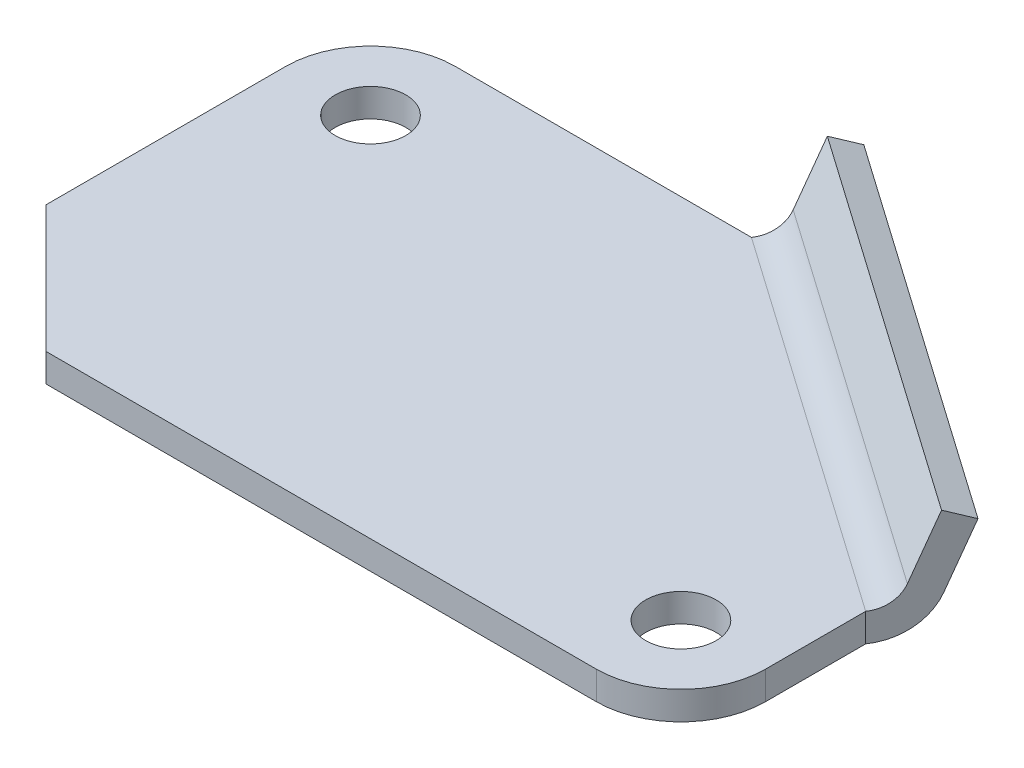
ISO-10303-21;
HEADER;
FILE_DESCRIPTION(('STEP AP214'),'2;1');
FILE_NAME('part.step','',(''),(''),'','','');
FILE_SCHEMA(('AUTOMOTIVE_DESIGN { 1 0 10303 214 1 1 1 1 }'));
ENDSEC;
DATA;
#1=APPLICATION_CONTEXT('core data for automotive mechanical design processes');
#2=APPLICATION_PROTOCOL_DEFINITION('international standard','automotive_design',2000,#1);
#3=PRODUCT_CONTEXT('',#1,'mechanical');
#4=PRODUCT('Part','Part','',(#3));
#5=PRODUCT_RELATED_PRODUCT_CATEGORY('part','',(#4));
#6=PRODUCT_DEFINITION_FORMATION('','',#4);
#7=PRODUCT_DEFINITION_CONTEXT('part definition',#1,'design');
#8=PRODUCT_DEFINITION('design','',#6,#7);
#9=PRODUCT_DEFINITION_SHAPE('','',#8);
#10=(LENGTH_UNIT() NAMED_UNIT(*) SI_UNIT(.MILLI.,.METRE.));
#11=(NAMED_UNIT(*) PLANE_ANGLE_UNIT() SI_UNIT($,.RADIAN.));
#12=(NAMED_UNIT(*) SI_UNIT($,.STERADIAN.) SOLID_ANGLE_UNIT());
#13=UNCERTAINTY_MEASURE_WITH_UNIT(LENGTH_MEASURE(1.E-05),#10,'distance_accuracy_value','');
#14=(GEOMETRIC_REPRESENTATION_CONTEXT(3) GLOBAL_UNCERTAINTY_ASSIGNED_CONTEXT((#13)) GLOBAL_UNIT_ASSIGNED_CONTEXT((#10,
#11,#12)) REPRESENTATION_CONTEXT('',''));
#15=CARTESIAN_POINT('',(0.,0.,0.));
#16=DIRECTION('',(0.,0.,1.));
#17=DIRECTION('',(1.,0.,0.));
#18=AXIS2_PLACEMENT_3D('',#15,#16,#17);
#19=CARTESIAN_POINT('',(96.,4.,-12.));
#20=DIRECTION('',(0.,1.,0.));
#21=DIRECTION('',(0.,0.,1.));
#22=AXIS2_PLACEMENT_3D('',#19,#20,#21);
#23=PLANE('',#22);
#24=CARTESIAN_POINT('',(12.,4.,-52.));
#25=DIRECTION('',(0.,1.,0.));
#26=DIRECTION('',(0.,0.,1.));
#27=AXIS2_PLACEMENT_3D('',#24,#25,#26);
#28=CIRCLE('',#27,5.);
#29=CARTESIAN_POINT('',(12.,4.,-47.));
#30=VERTEX_POINT('',#29);
#31=EDGE_CURVE('E143',#30,#30,#28,.T.);
#32=ORIENTED_EDGE('',*,*,#31,.F.);
#33=EDGE_LOOP('',(#32));
#34=FACE_BOUND('',#33,.T.);
#35=DIRECTION('',(1.,0.,0.));
#36=VECTOR('',#35,1.);
#37=CARTESIAN_POINT('',(18.,4.,0.));
#38=LINE('',#37,#36);
#39=CARTESIAN_POINT('',(18.,4.,0.));
#40=VERTEX_POINT('',#39);
#41=CARTESIAN_POINT('',(96.,4.,0.));
#42=VERTEX_POINT('',#41);
#43=EDGE_CURVE('E152',#40,#42,#38,.T.);
#44=ORIENTED_EDGE('',*,*,#43,.T.);
#45=CARTESIAN_POINT('',(96.,4.,-12.));
#46=DIRECTION('',(0.,1.,0.));
#47=DIRECTION('',(0.,0.,1.));
#48=AXIS2_PLACEMENT_3D('',#45,#46,#47);
#49=CIRCLE('',#48,12.);
#50=CARTESIAN_POINT('',(108.,4.,-12.));
#51=VERTEX_POINT('',#50);
#52=EDGE_CURVE('E100',#42,#51,#49,.T.);
#53=ORIENTED_EDGE('',*,*,#52,.T.);
#54=DIRECTION('',(0.,0.,-1.));
#55=VECTOR('',#54,1.);
#56=CARTESIAN_POINT('',(108.,4.,-12.));
#57=LINE('',#56,#55);
#58=CARTESIAN_POINT('',(108.,4.,-26.1887929366757));
#59=VERTEX_POINT('',#58);
#60=EDGE_CURVE('E169',#51,#59,#57,.T.);
#61=ORIENTED_EDGE('',*,*,#60,.T.);
#62=DIRECTION('',(-0.819152044288992,0.,-0.573576436351045));
#63=VECTOR('',#62,1.);
#64=CARTESIAN_POINT('',(54.,4.,-64.));
#65=LINE('',#64,#63);
#66=CARTESIAN_POINT('',(54.,4.,-64.));
#67=VERTEX_POINT('',#66);
#68=EDGE_CURVE('E237',#59,#67,#65,.T.);
#69=ORIENTED_EDGE('',*,*,#68,.T.);
#70=DIRECTION('',(-1.,0.,0.));
#71=VECTOR('',#70,1.);
#72=CARTESIAN_POINT('',(12.,4.,-64.));
#73=LINE('',#72,#71);
#74=CARTESIAN_POINT('',(12.,4.,-64.));
#75=VERTEX_POINT('',#74);
#76=EDGE_CURVE('E116',#67,#75,#73,.T.);
#77=ORIENTED_EDGE('',*,*,#76,.T.);
#78=CARTESIAN_POINT('',(12.,4.,-52.));
#79=DIRECTION('',(0.,1.,0.));
#80=DIRECTION('',(0.,0.,1.));
#81=AXIS2_PLACEMENT_3D('',#78,#79,#80);
#82=CIRCLE('',#81,12.);
#83=CARTESIAN_POINT('',(0.,4.,-52.));
#84=VERTEX_POINT('',#83);
#85=EDGE_CURVE('E114',#75,#84,#82,.T.);
#86=ORIENTED_EDGE('',*,*,#85,.T.);
#87=DIRECTION('',(0.,0.,1.));
#88=VECTOR('',#87,1.);
#89=CARTESIAN_POINT('',(0.,4.,-18.));
#90=LINE('',#89,#88);
#91=CARTESIAN_POINT('',(0.,4.,-18.));
#92=VERTEX_POINT('',#91);
#93=EDGE_CURVE('E120',#84,#92,#90,.T.);
#94=ORIENTED_EDGE('',*,*,#93,.T.);
#95=DIRECTION('',(0.707106781186547,0.,0.707106781186547));
#96=VECTOR('',#95,1.);
#97=CARTESIAN_POINT('',(0.,4.,-18.));
#98=LINE('',#97,#96);
#99=EDGE_CURVE('E57',#92,#40,#98,.T.);
#100=ORIENTED_EDGE('',*,*,#99,.T.);
#101=EDGE_LOOP('',(#44,#53,#61,#69,#77,#86,#94,#100));
#102=FACE_BOUND('',#101,.T.);
#103=CARTESIAN_POINT('',(96.,4.,-12.));
#104=DIRECTION('',(0.,1.,0.));
#105=DIRECTION('',(0.,0.,1.));
#106=AXIS2_PLACEMENT_3D('',#103,#104,#105);
#107=CIRCLE('',#106,5.);
#108=CARTESIAN_POINT('',(96.,4.,-7.));
#109=VERTEX_POINT('',#108);
#110=EDGE_CURVE('E224',#109,#109,#107,.T.);
#111=ORIENTED_EDGE('',*,*,#110,.F.);
#112=EDGE_LOOP('',(#111));
#113=FACE_BOUND('',#112,.T.);
#114=ADVANCED_FACE('F39',(#34,#102,#113),#23,.T.);
#115=CARTESIAN_POINT('',(96.,0.,-12.));
#116=DIRECTION('',(0.,1.,0.));
#117=DIRECTION('',(0.,0.,1.));
#118=AXIS2_PLACEMENT_3D('',#115,#116,#117);
#119=PLANE('',#118);
#120=DIRECTION('',(1.,0.,0.));
#121=VECTOR('',#120,1.);
#122=CARTESIAN_POINT('',(18.,0.,0.));
#123=LINE('',#122,#121);
#124=CARTESIAN_POINT('',(18.,0.,0.));
#125=VERTEX_POINT('',#124);
#126=CARTESIAN_POINT('',(96.,0.,0.));
#127=VERTEX_POINT('',#126);
#128=EDGE_CURVE('E136',#125,#127,#123,.T.);
#129=ORIENTED_EDGE('',*,*,#128,.F.);
#130=DIRECTION('',(0.707106781186547,0.,0.707106781186547));
#131=VECTOR('',#130,1.);
#132=CARTESIAN_POINT('',(0.,0.,-18.));
#133=LINE('',#132,#131);
#134=CARTESIAN_POINT('',(0.,0.,-18.));
#135=VERTEX_POINT('',#134);
#136=EDGE_CURVE('E90',#135,#125,#133,.T.);
#137=ORIENTED_EDGE('',*,*,#136,.F.);
#138=DIRECTION('',(0.,0.,1.));
#139=VECTOR('',#138,1.);
#140=CARTESIAN_POINT('',(0.,0.,-18.));
#141=LINE('',#140,#139);
#142=CARTESIAN_POINT('',(0.,0.,-52.));
#143=VERTEX_POINT('',#142);
#144=EDGE_CURVE('E85',#143,#135,#141,.T.);
#145=ORIENTED_EDGE('',*,*,#144,.F.);
#146=CARTESIAN_POINT('',(12.,0.,-52.));
#147=DIRECTION('',(0.,1.,0.));
#148=DIRECTION('',(0.,0.,1.));
#149=AXIS2_PLACEMENT_3D('',#146,#147,#148);
#150=CIRCLE('',#149,12.);
#151=CARTESIAN_POINT('',(12.,0.,-64.));
#152=VERTEX_POINT('',#151);
#153=EDGE_CURVE('E130',#152,#143,#150,.T.);
#154=ORIENTED_EDGE('',*,*,#153,.F.);
#155=DIRECTION('',(-1.,0.,0.));
#156=VECTOR('',#155,1.);
#157=CARTESIAN_POINT('',(12.,0.,-64.));
#158=LINE('',#157,#156);
#159=CARTESIAN_POINT('',(54.,0.,-64.));
#160=VERTEX_POINT('',#159);
#161=EDGE_CURVE('E149',#160,#152,#158,.T.);
#162=ORIENTED_EDGE('',*,*,#161,.F.);
#163=DIRECTION('',(-0.819152044288992,0.,-0.573576436351045));
#164=VECTOR('',#163,1.);
#165=CARTESIAN_POINT('',(54.,0.,-64.));
#166=LINE('',#165,#164);
#167=CARTESIAN_POINT('',(108.,0.,-26.1887929366758));
#168=VERTEX_POINT('',#167);
#169=EDGE_CURVE('E148',#168,#160,#166,.T.);
#170=ORIENTED_EDGE('',*,*,#169,.F.);
#171=DIRECTION('',(0.,0.,-1.));
#172=VECTOR('',#171,1.);
#173=CARTESIAN_POINT('',(108.,0.,-12.));
#174=LINE('',#173,#172);
#175=CARTESIAN_POINT('',(108.,0.,-12.));
#176=VERTEX_POINT('',#175);
#177=EDGE_CURVE('E141',#176,#168,#174,.T.);
#178=ORIENTED_EDGE('',*,*,#177,.F.);
#179=CARTESIAN_POINT('',(96.,0.,-12.));
#180=DIRECTION('',(0.,1.,0.));
#181=DIRECTION('',(0.,0.,1.));
#182=AXIS2_PLACEMENT_3D('',#179,#180,#181);
#183=CIRCLE('',#182,12.);
#184=EDGE_CURVE('E137',#127,#176,#183,.T.);
#185=ORIENTED_EDGE('',*,*,#184,.F.);
#186=EDGE_LOOP('',(#129,#137,#145,#154,#162,#170,#178,#185));
#187=FACE_BOUND('',#186,.T.);
#188=CARTESIAN_POINT('',(12.,0.,-52.));
#189=DIRECTION('',(0.,1.,0.));
#190=DIRECTION('',(0.,0.,1.));
#191=AXIS2_PLACEMENT_3D('',#188,#189,#190);
#192=CIRCLE('',#191,5.);
#193=CARTESIAN_POINT('',(12.,0.,-47.));
#194=VERTEX_POINT('',#193);
#195=EDGE_CURVE('E227',#194,#194,#192,.T.);
#196=ORIENTED_EDGE('',*,*,#195,.T.);
#197=EDGE_LOOP('',(#196));
#198=FACE_BOUND('',#197,.T.);
#199=CARTESIAN_POINT('',(96.,0.,-12.));
#200=DIRECTION('',(0.,1.,0.));
#201=DIRECTION('',(0.,0.,1.));
#202=AXIS2_PLACEMENT_3D('',#199,#200,#201);
#203=CIRCLE('',#202,5.);
#204=CARTESIAN_POINT('',(96.,0.,-7.));
#205=VERTEX_POINT('',#204);
#206=EDGE_CURVE('E225',#205,#205,#203,.T.);
#207=ORIENTED_EDGE('',*,*,#206,.T.);
#208=EDGE_LOOP('',(#207));
#209=FACE_BOUND('',#208,.T.);
#210=ADVANCED_FACE('F175',(#187,#198,#209),#119,.F.);
#211=CARTESIAN_POINT('',(18.,4.,0.));
#212=DIRECTION('',(0.,0.,-1.));
#213=DIRECTION('',(-1.,0.,0.));
#214=AXIS2_PLACEMENT_3D('',#211,#212,#213);
#215=PLANE('',#214);
#216=ORIENTED_EDGE('',*,*,#128,.T.);
#217=DIRECTION('',(0.,-1.,0.));
#218=VECTOR('',#217,1.);
#219=CARTESIAN_POINT('',(96.,4.,0.));
#220=LINE('',#219,#218);
#221=EDGE_CURVE('E11',#42,#127,#220,.T.);
#222=ORIENTED_EDGE('',*,*,#221,.F.);
#223=ORIENTED_EDGE('',*,*,#43,.F.);
#224=DIRECTION('',(0.,-1.,0.));
#225=VECTOR('',#224,1.);
#226=CARTESIAN_POINT('',(18.,4.,0.));
#227=LINE('',#226,#225);
#228=EDGE_CURVE('E134',#40,#125,#227,.T.);
#229=ORIENTED_EDGE('',*,*,#228,.T.);
#230=EDGE_LOOP('',(#216,#222,#223,#229));
#231=FACE_BOUND('',#230,.T.);
#232=ADVANCED_FACE('F41',(#231),#215,.F.);
#233=CARTESIAN_POINT('',(96.,4.,-12.));
#234=DIRECTION('',(0.,-1.,0.));
#235=DIRECTION('',(0.,0.,-1.));
#236=AXIS2_PLACEMENT_3D('',#233,#234,#235);
#237=CYLINDRICAL_SURFACE('',#236,12.);
#238=ORIENTED_EDGE('',*,*,#184,.T.);
#239=DIRECTION('',(0.,-1.,0.));
#240=VECTOR('',#239,1.);
#241=CARTESIAN_POINT('',(108.,4.,-12.));
#242=LINE('',#241,#240);
#243=EDGE_CURVE('E48',#51,#176,#242,.T.);
#244=ORIENTED_EDGE('',*,*,#243,.F.);
#245=ORIENTED_EDGE('',*,*,#52,.F.);
#246=ORIENTED_EDGE('',*,*,#221,.T.);
#247=EDGE_LOOP('',(#238,#244,#245,#246));
#248=FACE_BOUND('',#247,.T.);
#249=ADVANCED_FACE('F309',(#248),#237,.T.);
#250=CARTESIAN_POINT('',(108.,4.,-12.));
#251=DIRECTION('',(-1.,0.,0.));
#252=DIRECTION('',(0.,0.,1.));
#253=AXIS2_PLACEMENT_3D('',#250,#251,#252);
#254=PLANE('',#253);
#255=ORIENTED_EDGE('',*,*,#177,.T.);
#256=DIRECTION('',(0.,-1.,0.));
#257=VECTOR('',#256,1.);
#258=CARTESIAN_POINT('',(108.,4.,-26.1887929366757));
#259=LINE('',#258,#257);
#260=EDGE_CURVE('E159',#59,#168,#259,.T.);
#261=ORIENTED_EDGE('',*,*,#260,.F.);
#262=ORIENTED_EDGE('',*,*,#60,.F.);
#263=ORIENTED_EDGE('',*,*,#243,.T.);
#264=EDGE_LOOP('',(#255,#261,#262,#263));
#265=FACE_BOUND('',#264,.T.);
#266=ADVANCED_FACE('F167',(#265),#254,.F.);
#267=CARTESIAN_POINT('',(12.,4.,-64.));
#268=DIRECTION('',(0.,0.,1.));
#269=DIRECTION('',(1.,0.,0.));
#270=AXIS2_PLACEMENT_3D('',#267,#268,#269);
#271=PLANE('',#270);
#272=ORIENTED_EDGE('',*,*,#161,.T.);
#273=DIRECTION('',(0.,-1.,0.));
#274=VECTOR('',#273,1.);
#275=CARTESIAN_POINT('',(12.,4.,-64.));
#276=LINE('',#275,#274);
#277=EDGE_CURVE('E126',#75,#152,#276,.T.);
#278=ORIENTED_EDGE('',*,*,#277,.F.);
#279=ORIENTED_EDGE('',*,*,#76,.F.);
#280=DIRECTION('',(0.,-1.,0.));
#281=VECTOR('',#280,1.);
#282=CARTESIAN_POINT('',(54.,4.,-64.));
#283=LINE('',#282,#281);
#284=EDGE_CURVE('E158',#67,#160,#283,.T.);
#285=ORIENTED_EDGE('',*,*,#284,.T.);
#286=EDGE_LOOP('',(#272,#278,#279,#285));
#287=FACE_BOUND('',#286,.T.);
#288=ADVANCED_FACE('F242',(#287),#271,.F.);
#289=CARTESIAN_POINT('',(12.,4.,-52.));
#290=DIRECTION('',(0.,-1.,0.));
#291=DIRECTION('',(0.,0.,-1.));
#292=AXIS2_PLACEMENT_3D('',#289,#290,#291);
#293=CYLINDRICAL_SURFACE('',#292,12.);
#294=ORIENTED_EDGE('',*,*,#153,.T.);
#295=DIRECTION('',(0.,-1.,0.));
#296=VECTOR('',#295,1.);
#297=CARTESIAN_POINT('',(0.,4.,-52.));
#298=LINE('',#297,#296);
#299=EDGE_CURVE('E123',#84,#143,#298,.T.);
#300=ORIENTED_EDGE('',*,*,#299,.F.);
#301=ORIENTED_EDGE('',*,*,#85,.F.);
#302=ORIENTED_EDGE('',*,*,#277,.T.);
#303=EDGE_LOOP('',(#294,#300,#301,#302));
#304=FACE_BOUND('',#303,.T.);
#305=ADVANCED_FACE('F122',(#304),#293,.T.);
#306=CARTESIAN_POINT('',(0.,4.,-18.));
#307=DIRECTION('',(1.,0.,0.));
#308=DIRECTION('',(0.,0.,-1.));
#309=AXIS2_PLACEMENT_3D('',#306,#307,#308);
#310=PLANE('',#309);
#311=ORIENTED_EDGE('',*,*,#144,.T.);
#312=DIRECTION('',(0.,-1.,0.));
#313=VECTOR('',#312,1.);
#314=CARTESIAN_POINT('',(0.,4.,-18.));
#315=LINE('',#314,#313);
#316=EDGE_CURVE('E129',#92,#135,#315,.T.);
#317=ORIENTED_EDGE('',*,*,#316,.F.);
#318=ORIENTED_EDGE('',*,*,#93,.F.);
#319=ORIENTED_EDGE('',*,*,#299,.T.);
#320=EDGE_LOOP('',(#311,#317,#318,#319));
#321=FACE_BOUND('',#320,.T.);
#322=ADVANCED_FACE('F132',(#321),#310,.F.);
#323=CARTESIAN_POINT('',(0.,4.,-18.));
#324=DIRECTION('',(0.707106781186547,0.,-0.707106781186547));
#325=DIRECTION('',(-0.707106781186548,0.,-0.707106781186548));
#326=AXIS2_PLACEMENT_3D('',#323,#324,#325);
#327=PLANE('',#326);
#328=ORIENTED_EDGE('',*,*,#136,.T.);
#329=ORIENTED_EDGE('',*,*,#228,.F.);
#330=ORIENTED_EDGE('',*,*,#99,.F.);
#331=ORIENTED_EDGE('',*,*,#316,.T.);
#332=EDGE_LOOP('',(#328,#329,#330,#331));
#333=FACE_BOUND('',#332,.T.);
#334=ADVANCED_FACE('F298',(#333),#327,.F.);
#335=CARTESIAN_POINT('',(12.,4.,-52.));
#336=DIRECTION('',(0.,-1.,0.));
#337=DIRECTION('',(0.,0.,-1.));
#338=AXIS2_PLACEMENT_3D('',#335,#336,#337);
#339=CYLINDRICAL_SURFACE('',#338,5.);
#340=ORIENTED_EDGE('',*,*,#31,.T.);
#341=EDGE_LOOP('',(#340));
#342=FACE_BOUND('',#341,.T.);
#343=ORIENTED_EDGE('',*,*,#195,.F.);
#344=EDGE_LOOP('',(#343));
#345=FACE_BOUND('',#344,.T.);
#346=ADVANCED_FACE('F300',(#342,#345),#339,.F.);
#347=CARTESIAN_POINT('',(96.,4.,-12.));
#348=DIRECTION('',(0.,-1.,0.));
#349=DIRECTION('',(0.,0.,-1.));
#350=AXIS2_PLACEMENT_3D('',#347,#348,#349);
#351=CYLINDRICAL_SURFACE('',#350,5.);
#352=ORIENTED_EDGE('',*,*,#110,.T.);
#353=EDGE_LOOP('',(#352));
#354=FACE_BOUND('',#353,.T.);
#355=ORIENTED_EDGE('',*,*,#206,.F.);
#356=EDGE_LOOP('',(#355));
#357=FACE_BOUND('',#356,.T.);
#358=ADVANCED_FACE('F369',(#354,#357),#351,.F.);
#359=CARTESIAN_POINT('',(108.,8.5825091964613,-26.1887929366758));
#360=DIRECTION('',(-0.819152044288992,0.,-0.573576436351045));
#361=DIRECTION('',(-0.573576436351045,0.,0.819152044288992));
#362=AXIS2_PLACEMENT_3D('',#359,#360,#361);
#363=CYLINDRICAL_SURFACE('',#362,8.5825091964613);
#364=CARTESIAN_POINT('',(54.,8.5825091964613,-64.));
#365=DIRECTION('',(0.819152044288992,0.,0.573576436351045));
#366=DIRECTION('',(0.573576436351045,0.,-0.819152044288992));
#367=AXIS2_PLACEMENT_3D('',#364,#365,#366);
#368=CIRCLE('',#367,8.5825091964613);
#369=CARTESIAN_POINT('',(58.5642711774265,5.36744466341422,-70.5184547842721));
#370=VERTEX_POINT('',#369);
#371=EDGE_CURVE('E184',#160,#370,#368,.T.);
#372=ORIENTED_EDGE('',*,*,#371,.T.);
#373=DIRECTION('',(-0.819152044288992,0.,-0.573576436351045));
#374=VECTOR('',#373,1.);
#375=CARTESIAN_POINT('',(112.564271177426,5.36744466341422,-32.7072477209479));
#376=LINE('',#375,#374);
#377=CARTESIAN_POINT('',(112.564271177426,5.36744466341422,-32.7072477209479));
#378=VERTEX_POINT('',#377);
#379=EDGE_CURVE('E219',#378,#370,#376,.T.);
#380=ORIENTED_EDGE('',*,*,#379,.F.);
#381=CARTESIAN_POINT('',(108.,8.5825091964613,-26.1887929366758));
#382=DIRECTION('',(0.819152044288992,0.,0.573576436351045));
#383=DIRECTION('',(0.573576436351045,0.,-0.819152044288992));
#384=AXIS2_PLACEMENT_3D('',#381,#382,#383);
#385=CIRCLE('',#384,8.5825091964613);
#386=EDGE_CURVE('E187',#168,#378,#385,.T.);
#387=ORIENTED_EDGE('',*,*,#386,.F.);
#388=ORIENTED_EDGE('',*,*,#169,.T.);
#389=EDGE_LOOP('',(#372,#380,#387,#388));
#390=FACE_BOUND('',#389,.T.);
#391=ADVANCED_FACE('F182',(#390),#363,.T.);
#392=CARTESIAN_POINT('',(112.564271177426,5.36744466341422,-32.7072477209479));
#393=DIRECTION('',(-0.531810811144645,0.374606593415909,0.759504549900132));
#394=DIRECTION('',(0.819152044288992,0.,0.573576436351045));
#395=AXIS2_PLACEMENT_3D('',#392,#393,#394);
#396=PLANE('',#395);
#397=DIRECTION('',(0.214865514885103,0.927183854566788,-0.306859756800777));
#398=VECTOR('',#397,1.);
#399=CARTESIAN_POINT('',(58.5642711774265,5.36744466341422,-70.5184547842721));
#400=LINE('',#399,#398);
#401=CARTESIAN_POINT('',(60.558294875493,13.9720203183746,-73.3662157540624));
#402=VERTEX_POINT('',#401);
#403=EDGE_CURVE('E193',#370,#402,#400,.T.);
#404=ORIENTED_EDGE('',*,*,#403,.T.);
#405=DIRECTION('',(-0.819152044288992,0.,-0.573576436351045));
#406=VECTOR('',#405,1.);
#407=CARTESIAN_POINT('',(114.558294875493,13.9720203183746,-35.5550086907382));
#408=LINE('',#407,#406);
#409=CARTESIAN_POINT('',(114.558294875493,13.9720203183746,-35.5550086907382));
#410=VERTEX_POINT('',#409);
#411=EDGE_CURVE('E220',#410,#402,#408,.T.);
#412=ORIENTED_EDGE('',*,*,#411,.F.);
#413=DIRECTION('',(0.214865514885103,0.927183854566788,-0.306859756800777));
#414=VECTOR('',#413,1.);
#415=CARTESIAN_POINT('',(112.564271177426,5.36744466341422,-32.7072477209479));
#416=LINE('',#415,#414);
#417=EDGE_CURVE('E262',#378,#410,#416,.T.);
#418=ORIENTED_EDGE('',*,*,#417,.F.);
#419=ORIENTED_EDGE('',*,*,#379,.T.);
#420=EDGE_LOOP('',(#404,#412,#418,#419));
#421=FACE_BOUND('',#420,.T.);
#422=ADVANCED_FACE('F271',(#421),#396,.F.);
#423=CARTESIAN_POINT('',(114.558294875493,13.9720203183746,-35.5550086907382));
#424=DIRECTION('',(-0.214865514885104,-0.927183854566787,0.306859756800779));
#425=DIRECTION('',(0.,-0.314198283252714,-0.949357382022728));
#426=AXIS2_PLACEMENT_3D('',#423,#424,#425);
#427=PLANE('',#426);
#428=DIRECTION('',(-0.531810811144644,0.374606593415912,0.759504549900131));
#429=VECTOR('',#428,1.);
#430=CARTESIAN_POINT('',(60.558294875493,13.9720203183746,-73.3662157540624));
#431=LINE('',#430,#429);
#432=CARTESIAN_POINT('',(58.4310516309145,15.4704466920382,-70.3281975544619));
#433=VERTEX_POINT('',#432);
#434=EDGE_CURVE('E197',#402,#433,#431,.T.);
#435=ORIENTED_EDGE('',*,*,#434,.T.);
#436=DIRECTION('',(-0.819152044288992,0.,-0.573576436351045));
#437=VECTOR('',#436,1.);
#438=CARTESIAN_POINT('',(112.431051630914,15.4704466920382,-32.5169904911376));
#439=LINE('',#438,#437);
#440=CARTESIAN_POINT('',(112.431051630914,15.4704466920382,-32.5169904911376));
#441=VERTEX_POINT('',#440);
#442=EDGE_CURVE('E212',#441,#433,#439,.T.);
#443=ORIENTED_EDGE('',*,*,#442,.F.);
#444=DIRECTION('',(-0.531810811144644,0.374606593415912,0.759504549900131));
#445=VECTOR('',#444,1.);
#446=CARTESIAN_POINT('',(114.558294875493,13.9720203183746,-35.5550086907382));
#447=LINE('',#446,#445);
#448=EDGE_CURVE('E268',#410,#441,#447,.T.);
#449=ORIENTED_EDGE('',*,*,#448,.F.);
#450=ORIENTED_EDGE('',*,*,#411,.T.);
#451=EDGE_LOOP('',(#435,#443,#449,#450));
#452=FACE_BOUND('',#451,.T.);
#453=ADVANCED_FACE('F275',(#452),#427,.F.);
#454=CARTESIAN_POINT('',(110.437027932848,6.86587103707785,-29.6692295213473));
#455=DIRECTION('',(0.531810811144644,-0.37460659341591,-0.759504549900132));
#456=DIRECTION('',(-0.819152044288992,0.,-0.573576436351045));
#457=AXIS2_PLACEMENT_3D('',#454,#455,#456);
#458=PLANE('',#457);
#459=DIRECTION('',(-0.214865514885102,-0.927183854566788,0.306859756800778));
#460=VECTOR('',#459,1.);
#461=CARTESIAN_POINT('',(56.4370279328479,6.86587103707785,-67.4804365846716));
#462=LINE('',#461,#460);
#463=CARTESIAN_POINT('',(56.4370279328479,6.86587103707785,-67.4804365846716));
#464=VERTEX_POINT('',#463);
#465=EDGE_CURVE('E202',#433,#464,#462,.T.);
#466=ORIENTED_EDGE('',*,*,#465,.T.);
#467=DIRECTION('',(-0.819152044288992,0.,-0.573576436351045));
#468=VECTOR('',#467,1.);
#469=CARTESIAN_POINT('',(110.437027932848,6.86587103707785,-29.6692295213473));
#470=LINE('',#469,#468);
#471=CARTESIAN_POINT('',(110.437027932848,6.86587103707785,-29.6692295213473));
#472=VERTEX_POINT('',#471);
#473=EDGE_CURVE('E211',#472,#464,#470,.T.);
#474=ORIENTED_EDGE('',*,*,#473,.F.);
#475=DIRECTION('',(-0.214865514885102,-0.927183854566788,0.306859756800778));
#476=VECTOR('',#475,1.);
#477=CARTESIAN_POINT('',(110.437027932848,6.86587103707785,-29.6692295213473));
#478=LINE('',#477,#476);
#479=EDGE_CURVE('E273',#441,#472,#478,.T.);
#480=ORIENTED_EDGE('',*,*,#479,.F.);
#481=ORIENTED_EDGE('',*,*,#442,.T.);
#482=EDGE_LOOP('',(#466,#474,#480,#481));
#483=FACE_BOUND('',#482,.T.);
#484=ADVANCED_FACE('F279',(#483),#458,.F.);
#485=CARTESIAN_POINT('',(108.,8.5825091964613,-26.1887929366758));
#486=DIRECTION('',(-0.819152044288992,0.,-0.573576436351045));
#487=DIRECTION('',(-0.573576436351045,0.,0.819152044288992));
#488=AXIS2_PLACEMENT_3D('',#485,#486,#487);
#489=CYLINDRICAL_SURFACE('',#488,4.5825091964613);
#490=CARTESIAN_POINT('',(54.,8.5825091964613,-64.));
#491=DIRECTION('',(-0.819152044288992,0.,-0.573576436351045));
#492=DIRECTION('',(0.573576436351045,0.,-0.819152044288992));
#493=AXIS2_PLACEMENT_3D('',#490,#491,#492);
#494=CIRCLE('',#493,4.5825091964613);
#495=EDGE_CURVE('E208',#464,#67,#494,.T.);
#496=ORIENTED_EDGE('',*,*,#495,.T.);
#497=ORIENTED_EDGE('',*,*,#68,.F.);
#498=CARTESIAN_POINT('',(108.,8.5825091964613,-26.1887929366758));
#499=DIRECTION('',(-0.819152044288992,0.,-0.573576436351045));
#500=DIRECTION('',(0.573576436351045,0.,-0.819152044288992));
#501=AXIS2_PLACEMENT_3D('',#498,#499,#500);
#502=CIRCLE('',#501,4.5825091964613);
#503=EDGE_CURVE('E199',#472,#59,#502,.T.);
#504=ORIENTED_EDGE('',*,*,#503,.F.);
#505=ORIENTED_EDGE('',*,*,#473,.T.);
#506=EDGE_LOOP('',(#496,#497,#504,#505));
#507=FACE_BOUND('',#506,.T.);
#508=ADVANCED_FACE('F245',(#507),#489,.F.);
#509=CARTESIAN_POINT('',(108.,8.5825091964613,-26.1887929366758));
#510=DIRECTION('',(0.819152044288992,0.,0.573576436351045));
#511=DIRECTION('',(0.573576436351045,0.,-0.819152044288992));
#512=AXIS2_PLACEMENT_3D('',#509,#510,#511);
#513=PLANE('',#512);
#514=ORIENTED_EDGE('',*,*,#386,.T.);
#515=ORIENTED_EDGE('',*,*,#417,.T.);
#516=ORIENTED_EDGE('',*,*,#448,.T.);
#517=ORIENTED_EDGE('',*,*,#479,.T.);
#518=ORIENTED_EDGE('',*,*,#503,.T.);
#519=ORIENTED_EDGE('',*,*,#260,.T.);
#520=EDGE_LOOP('',(#514,#515,#516,#517,#518,#519));
#521=FACE_BOUND('',#520,.T.);
#522=ADVANCED_FACE('F266',(#521),#513,.T.);
#523=CARTESIAN_POINT('',(54.,8.5825091964613,-64.));
#524=DIRECTION('',(0.819152044288992,0.,0.573576436351045));
#525=DIRECTION('',(0.573576436351045,0.,-0.819152044288992));
#526=AXIS2_PLACEMENT_3D('',#523,#524,#525);
#527=PLANE('',#526);
#528=ORIENTED_EDGE('',*,*,#371,.F.);
#529=ORIENTED_EDGE('',*,*,#284,.F.);
#530=ORIENTED_EDGE('',*,*,#495,.F.);
#531=ORIENTED_EDGE('',*,*,#465,.F.);
#532=ORIENTED_EDGE('',*,*,#434,.F.);
#533=ORIENTED_EDGE('',*,*,#403,.F.);
#534=EDGE_LOOP('',(#528,#529,#530,#531,#532,#533));
#535=FACE_BOUND('',#534,.T.);
#536=ADVANCED_FACE('F188',(#535),#527,.F.);
#537=CLOSED_SHELL('',(#114,#210,#232,#249,#266,#288,#305,#322,#334,#346,#358,#391,#422,#453,
#484,#508,#522,#536));
#538=MANIFOLD_SOLID_BREP('B2',#537);
#539=ADVANCED_BREP_SHAPE_REPRESENTATION('',(#18,#538),#14);
#540=SHAPE_DEFINITION_REPRESENTATION(#9,#539);
ENDSEC;
END-ISO-10303-21;
